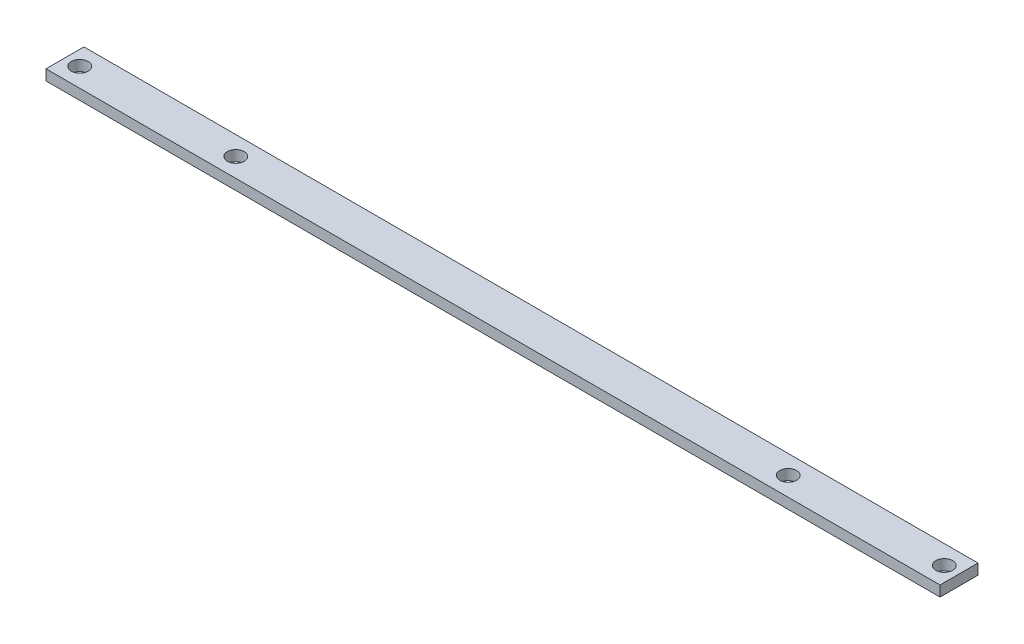
ISO-10303-21;
HEADER;
FILE_DESCRIPTION(('STEP AP214'),'2;1');
FILE_NAME('part.step','',(''),(''),'','','');
FILE_SCHEMA(('AUTOMOTIVE_DESIGN { 1 0 10303 214 1 1 1 1 }'));
ENDSEC;
DATA;
#1=APPLICATION_CONTEXT('core data for automotive mechanical design processes');
#2=APPLICATION_PROTOCOL_DEFINITION('international standard','automotive_design',2000,#1);
#3=PRODUCT_CONTEXT('',#1,'mechanical');
#4=PRODUCT('Part','Part','',(#3));
#5=PRODUCT_RELATED_PRODUCT_CATEGORY('part','',(#4));
#6=PRODUCT_DEFINITION_FORMATION('','',#4);
#7=PRODUCT_DEFINITION_CONTEXT('part definition',#1,'design');
#8=PRODUCT_DEFINITION('design','',#6,#7);
#9=PRODUCT_DEFINITION_SHAPE('','',#8);
#10=(LENGTH_UNIT() NAMED_UNIT(*) SI_UNIT(.MILLI.,.METRE.));
#11=(NAMED_UNIT(*) PLANE_ANGLE_UNIT() SI_UNIT($,.RADIAN.));
#12=(NAMED_UNIT(*) SI_UNIT($,.STERADIAN.) SOLID_ANGLE_UNIT());
#13=UNCERTAINTY_MEASURE_WITH_UNIT(LENGTH_MEASURE(1.E-05),#10,'distance_accuracy_value','');
#14=(GEOMETRIC_REPRESENTATION_CONTEXT(3) GLOBAL_UNCERTAINTY_ASSIGNED_CONTEXT((#13)) GLOBAL_UNIT_ASSIGNED_CONTEXT((#10,
#11,#12)) REPRESENTATION_CONTEXT('',''));
#15=CARTESIAN_POINT('',(0.,0.,0.));
#16=DIRECTION('',(0.,0.,1.));
#17=DIRECTION('',(1.,0.,0.));
#18=AXIS2_PLACEMENT_3D('',#15,#16,#17);
#19=CARTESIAN_POINT('',(0.,2.5,0.));
#20=DIRECTION('',(0.,-1.,0.));
#21=DIRECTION('',(0.,0.,-1.));
#22=AXIS2_PLACEMENT_3D('',#19,#20,#21);
#23=PLANE('',#22);
#24=DIRECTION('',(0.,0.,-1.));
#25=VECTOR('',#24,1.);
#26=CARTESIAN_POINT('',(0.,2.5,0.));
#27=LINE('',#26,#25);
#28=CARTESIAN_POINT('',(0.,2.5,0.));
#29=VERTEX_POINT('',#28);
#30=CARTESIAN_POINT('',(0.,2.5,-9.));
#31=VERTEX_POINT('',#30);
#32=EDGE_CURVE('E164',#29,#31,#27,.T.);
#33=ORIENTED_EDGE('',*,*,#32,.F.);
#34=DIRECTION('',(1.,0.,0.));
#35=VECTOR('',#34,1.);
#36=CARTESIAN_POINT('',(0.,2.5,0.));
#37=LINE('',#36,#35);
#38=CARTESIAN_POINT('',(212.,2.5,0.));
#39=VERTEX_POINT('',#38);
#40=EDGE_CURVE('E151',#29,#39,#37,.T.);
#41=ORIENTED_EDGE('',*,*,#40,.T.);
#42=DIRECTION('',(0.,0.,-1.));
#43=VECTOR('',#42,1.);
#44=CARTESIAN_POINT('',(212.,2.5,0.));
#45=LINE('',#44,#43);
#46=CARTESIAN_POINT('',(212.,2.5,-9.));
#47=VERTEX_POINT('',#46);
#48=EDGE_CURVE('E146',#39,#47,#45,.T.);
#49=ORIENTED_EDGE('',*,*,#48,.T.);
#50=DIRECTION('',(1.,0.,0.));
#51=VECTOR('',#50,1.);
#52=CARTESIAN_POINT('',(0.,2.5,-9.));
#53=LINE('',#52,#51);
#54=EDGE_CURVE('E150',#31,#47,#53,.T.);
#55=ORIENTED_EDGE('',*,*,#54,.F.);
#56=EDGE_LOOP('',(#33,#41,#49,#55));
#57=FACE_BOUND('',#56,.T.);
#58=CARTESIAN_POINT('',(3.5,2.5,-4.5));
#59=DIRECTION('',(0.,1.,0.));
#60=DIRECTION('',(0.,0.,1.));
#61=AXIS2_PLACEMENT_3D('',#58,#59,#60);
#62=CIRCLE('',#61,2.);
#63=CARTESIAN_POINT('',(3.5,2.5,-2.5));
#64=VERTEX_POINT('',#63);
#65=EDGE_CURVE('E177',#64,#64,#62,.T.);
#66=ORIENTED_EDGE('',*,*,#65,.F.);
#67=EDGE_LOOP('',(#66));
#68=FACE_BOUND('',#67,.T.);
#69=CARTESIAN_POINT('',(40.5,2.5,-4.5));
#70=DIRECTION('',(0.,1.,0.));
#71=DIRECTION('',(0.,0.,1.));
#72=AXIS2_PLACEMENT_3D('',#69,#70,#71);
#73=CIRCLE('',#72,2.);
#74=CARTESIAN_POINT('',(40.5,2.5,-2.5));
#75=VERTEX_POINT('',#74);
#76=EDGE_CURVE('E226',#75,#75,#73,.T.);
#77=ORIENTED_EDGE('',*,*,#76,.F.);
#78=EDGE_LOOP('',(#77));
#79=FACE_BOUND('',#78,.T.);
#80=CARTESIAN_POINT('',(171.5,2.5,-4.5));
#81=DIRECTION('',(0.,1.,0.));
#82=DIRECTION('',(0.,0.,1.));
#83=AXIS2_PLACEMENT_3D('',#80,#81,#82);
#84=CIRCLE('',#83,2.);
#85=CARTESIAN_POINT('',(171.5,2.5,-2.5));
#86=VERTEX_POINT('',#85);
#87=EDGE_CURVE('E236',#86,#86,#84,.T.);
#88=ORIENTED_EDGE('',*,*,#87,.F.);
#89=EDGE_LOOP('',(#88));
#90=FACE_BOUND('',#89,.T.);
#91=CARTESIAN_POINT('',(208.5,2.5,-4.5));
#92=DIRECTION('',(0.,1.,0.));
#93=DIRECTION('',(0.,0.,1.));
#94=AXIS2_PLACEMENT_3D('',#91,#92,#93);
#95=CIRCLE('',#94,2.);
#96=CARTESIAN_POINT('',(208.5,2.5,-2.5));
#97=VERTEX_POINT('',#96);
#98=EDGE_CURVE('E242',#97,#97,#95,.T.);
#99=ORIENTED_EDGE('',*,*,#98,.F.);
#100=EDGE_LOOP('',(#99));
#101=FACE_BOUND('',#100,.T.);
#102=ADVANCED_FACE('F99',(#57,#68,#79,#90,#101),#23,.F.);
#103=CARTESIAN_POINT('',(0.,0.,0.));
#104=DIRECTION('',(0.,-1.,0.));
#105=DIRECTION('',(0.,0.,-1.));
#106=AXIS2_PLACEMENT_3D('',#103,#104,#105);
#107=PLANE('',#106);
#108=CARTESIAN_POINT('',(171.5,0.,-4.5));
#109=DIRECTION('',(0.,1.,0.));
#110=DIRECTION('',(0.,0.,1.));
#111=AXIS2_PLACEMENT_3D('',#108,#109,#110);
#112=CIRCLE('',#111,2.);
#113=CARTESIAN_POINT('',(171.5,0.,-2.5));
#114=VERTEX_POINT('',#113);
#115=EDGE_CURVE('E238',#114,#114,#112,.T.);
#116=ORIENTED_EDGE('',*,*,#115,.T.);
#117=EDGE_LOOP('',(#116));
#118=FACE_BOUND('',#117,.T.);
#119=CARTESIAN_POINT('',(3.5,0.,-4.5));
#120=DIRECTION('',(0.,1.,0.));
#121=DIRECTION('',(0.,0.,1.));
#122=AXIS2_PLACEMENT_3D('',#119,#120,#121);
#123=CIRCLE('',#122,2.);
#124=CARTESIAN_POINT('',(3.5,0.,-2.5));
#125=VERTEX_POINT('',#124);
#126=EDGE_CURVE('E223',#125,#125,#123,.T.);
#127=ORIENTED_EDGE('',*,*,#126,.T.);
#128=EDGE_LOOP('',(#127));
#129=FACE_BOUND('',#128,.T.);
#130=DIRECTION('',(0.,0.,-1.));
#131=VECTOR('',#130,1.);
#132=CARTESIAN_POINT('',(0.,0.,0.));
#133=LINE('',#132,#131);
#134=CARTESIAN_POINT('',(0.,0.,0.));
#135=VERTEX_POINT('',#134);
#136=CARTESIAN_POINT('',(0.,0.,-9.));
#137=VERTEX_POINT('',#136);
#138=EDGE_CURVE('E172',#135,#137,#133,.T.);
#139=ORIENTED_EDGE('',*,*,#138,.T.);
#140=DIRECTION('',(1.,0.,0.));
#141=VECTOR('',#140,1.);
#142=CARTESIAN_POINT('',(0.,0.,-9.));
#143=LINE('',#142,#141);
#144=CARTESIAN_POINT('',(212.,0.,-9.));
#145=VERTEX_POINT('',#144);
#146=EDGE_CURVE('E176',#137,#145,#143,.T.);
#147=ORIENTED_EDGE('',*,*,#146,.T.);
#148=DIRECTION('',(0.,0.,-1.));
#149=VECTOR('',#148,1.);
#150=CARTESIAN_POINT('',(212.,0.,0.));
#151=LINE('',#150,#149);
#152=CARTESIAN_POINT('',(212.,0.,0.));
#153=VERTEX_POINT('',#152);
#154=EDGE_CURVE('E159',#153,#145,#151,.T.);
#155=ORIENTED_EDGE('',*,*,#154,.F.);
#156=DIRECTION('',(1.,0.,0.));
#157=VECTOR('',#156,1.);
#158=CARTESIAN_POINT('',(0.,0.,0.));
#159=LINE('',#158,#157);
#160=EDGE_CURVE('E134',#135,#153,#159,.T.);
#161=ORIENTED_EDGE('',*,*,#160,.F.);
#162=EDGE_LOOP('',(#139,#147,#155,#161));
#163=FACE_BOUND('',#162,.T.);
#164=CARTESIAN_POINT('',(40.5,0.,-4.5));
#165=DIRECTION('',(0.,1.,0.));
#166=DIRECTION('',(0.,0.,1.));
#167=AXIS2_PLACEMENT_3D('',#164,#165,#166);
#168=CIRCLE('',#167,2.);
#169=CARTESIAN_POINT('',(40.5,0.,-2.5));
#170=VERTEX_POINT('',#169);
#171=EDGE_CURVE('E231',#170,#170,#168,.T.);
#172=ORIENTED_EDGE('',*,*,#171,.T.);
#173=EDGE_LOOP('',(#172));
#174=FACE_BOUND('',#173,.T.);
#175=CARTESIAN_POINT('',(208.5,0.,-4.5));
#176=DIRECTION('',(0.,1.,0.));
#177=DIRECTION('',(0.,0.,1.));
#178=AXIS2_PLACEMENT_3D('',#175,#176,#177);
#179=CIRCLE('',#178,2.);
#180=CARTESIAN_POINT('',(208.5,0.,-2.5));
#181=VERTEX_POINT('',#180);
#182=EDGE_CURVE('E246',#181,#181,#179,.T.);
#183=ORIENTED_EDGE('',*,*,#182,.T.);
#184=EDGE_LOOP('',(#183));
#185=FACE_BOUND('',#184,.T.);
#186=ADVANCED_FACE('F186',(#118,#129,#163,#174,#185),#107,.T.);
#187=CARTESIAN_POINT('',(0.,2.5,0.));
#188=DIRECTION('',(-1.,0.,0.));
#189=DIRECTION('',(0.,0.,1.));
#190=AXIS2_PLACEMENT_3D('',#187,#188,#189);
#191=PLANE('',#190);
#192=ORIENTED_EDGE('',*,*,#138,.F.);
#193=DIRECTION('',(0.,-1.,0.));
#194=VECTOR('',#193,1.);
#195=CARTESIAN_POINT('',(0.,2.5,0.));
#196=LINE('',#195,#194);
#197=EDGE_CURVE('E12',#29,#135,#196,.T.);
#198=ORIENTED_EDGE('',*,*,#197,.F.);
#199=ORIENTED_EDGE('',*,*,#32,.T.);
#200=DIRECTION('',(0.,-1.,0.));
#201=VECTOR('',#200,1.);
#202=CARTESIAN_POINT('',(0.,2.5,-9.));
#203=LINE('',#202,#201);
#204=EDGE_CURVE('E103',#31,#137,#203,.T.);
#205=ORIENTED_EDGE('',*,*,#204,.T.);
#206=EDGE_LOOP('',(#192,#198,#199,#205));
#207=FACE_BOUND('',#206,.T.);
#208=ADVANCED_FACE('F101',(#207),#191,.T.);
#209=CARTESIAN_POINT('',(0.,2.5,0.));
#210=DIRECTION('',(0.,0.,-1.));
#211=DIRECTION('',(-1.,0.,0.));
#212=AXIS2_PLACEMENT_3D('',#209,#210,#211);
#213=PLANE('',#212);
#214=ORIENTED_EDGE('',*,*,#160,.T.);
#215=DIRECTION('',(0.,-1.,0.));
#216=VECTOR('',#215,1.);
#217=CARTESIAN_POINT('',(212.,2.5,0.));
#218=LINE('',#217,#216);
#219=EDGE_CURVE('E110',#39,#153,#218,.T.);
#220=ORIENTED_EDGE('',*,*,#219,.F.);
#221=ORIENTED_EDGE('',*,*,#40,.F.);
#222=ORIENTED_EDGE('',*,*,#197,.T.);
#223=EDGE_LOOP('',(#214,#220,#221,#222));
#224=FACE_BOUND('',#223,.T.);
#225=ADVANCED_FACE('F190',(#224),#213,.F.);
#226=CARTESIAN_POINT('',(212.,2.5,0.));
#227=DIRECTION('',(-1.,0.,0.));
#228=DIRECTION('',(0.,0.,1.));
#229=AXIS2_PLACEMENT_3D('',#226,#227,#228);
#230=PLANE('',#229);
#231=ORIENTED_EDGE('',*,*,#154,.T.);
#232=DIRECTION('',(0.,-1.,0.));
#233=VECTOR('',#232,1.);
#234=CARTESIAN_POINT('',(212.,2.5,-9.));
#235=LINE('',#234,#233);
#236=EDGE_CURVE('E156',#47,#145,#235,.T.);
#237=ORIENTED_EDGE('',*,*,#236,.F.);
#238=ORIENTED_EDGE('',*,*,#48,.F.);
#239=ORIENTED_EDGE('',*,*,#219,.T.);
#240=EDGE_LOOP('',(#231,#237,#238,#239));
#241=FACE_BOUND('',#240,.T.);
#242=ADVANCED_FACE('F157',(#241),#230,.F.);
#243=CARTESIAN_POINT('',(0.,2.5,-9.));
#244=DIRECTION('',(0.,0.,-1.));
#245=DIRECTION('',(-1.,0.,0.));
#246=AXIS2_PLACEMENT_3D('',#243,#244,#245);
#247=PLANE('',#246);
#248=ORIENTED_EDGE('',*,*,#146,.F.);
#249=ORIENTED_EDGE('',*,*,#204,.F.);
#250=ORIENTED_EDGE('',*,*,#54,.T.);
#251=ORIENTED_EDGE('',*,*,#236,.T.);
#252=EDGE_LOOP('',(#248,#249,#250,#251));
#253=FACE_BOUND('',#252,.T.);
#254=ADVANCED_FACE('F162',(#253),#247,.T.);
#255=CARTESIAN_POINT('',(3.5,2.5,-4.5));
#256=DIRECTION('',(0.,-1.,0.));
#257=DIRECTION('',(0.,0.,-1.));
#258=AXIS2_PLACEMENT_3D('',#255,#256,#257);
#259=CYLINDRICAL_SURFACE('',#258,2.);
#260=ORIENTED_EDGE('',*,*,#65,.T.);
#261=EDGE_LOOP('',(#260));
#262=FACE_BOUND('',#261,.T.);
#263=ORIENTED_EDGE('',*,*,#126,.F.);
#264=EDGE_LOOP('',(#263));
#265=FACE_BOUND('',#264,.T.);
#266=ADVANCED_FACE('F203',(#262,#265),#259,.F.);
#267=CARTESIAN_POINT('',(40.5,2.5,-4.5));
#268=DIRECTION('',(0.,-1.,0.));
#269=DIRECTION('',(0.,0.,-1.));
#270=AXIS2_PLACEMENT_3D('',#267,#268,#269);
#271=CYLINDRICAL_SURFACE('',#270,2.);
#272=ORIENTED_EDGE('',*,*,#76,.T.);
#273=EDGE_LOOP('',(#272));
#274=FACE_BOUND('',#273,.T.);
#275=ORIENTED_EDGE('',*,*,#171,.F.);
#276=EDGE_LOOP('',(#275));
#277=FACE_BOUND('',#276,.T.);
#278=ADVANCED_FACE('F211',(#274,#277),#271,.F.);
#279=CARTESIAN_POINT('',(171.5,2.5,-4.5));
#280=DIRECTION('',(0.,-1.,0.));
#281=DIRECTION('',(0.,0.,-1.));
#282=AXIS2_PLACEMENT_3D('',#279,#280,#281);
#283=CYLINDRICAL_SURFACE('',#282,2.);
#284=ORIENTED_EDGE('',*,*,#87,.T.);
#285=EDGE_LOOP('',(#284));
#286=FACE_BOUND('',#285,.T.);
#287=ORIENTED_EDGE('',*,*,#115,.F.);
#288=EDGE_LOOP('',(#287));
#289=FACE_BOUND('',#288,.T.);
#290=ADVANCED_FACE('F216',(#286,#289),#283,.F.);
#291=CARTESIAN_POINT('',(208.5,2.5,-4.5));
#292=DIRECTION('',(0.,-1.,0.));
#293=DIRECTION('',(0.,0.,-1.));
#294=AXIS2_PLACEMENT_3D('',#291,#292,#293);
#295=CYLINDRICAL_SURFACE('',#294,2.);
#296=ORIENTED_EDGE('',*,*,#98,.T.);
#297=EDGE_LOOP('',(#296));
#298=FACE_BOUND('',#297,.T.);
#299=ORIENTED_EDGE('',*,*,#182,.F.);
#300=EDGE_LOOP('',(#299));
#301=FACE_BOUND('',#300,.T.);
#302=ADVANCED_FACE('F254',(#298,#301),#295,.F.);
#303=CLOSED_SHELL('',(#102,#186,#208,#225,#242,#254,#266,#278,#290,#302));
#304=MANIFOLD_SOLID_BREP('B2',#303);
#305=ADVANCED_BREP_SHAPE_REPRESENTATION('',(#18,#304),#14);
#306=SHAPE_DEFINITION_REPRESENTATION(#9,#305);
ENDSEC;
END-ISO-10303-21;
